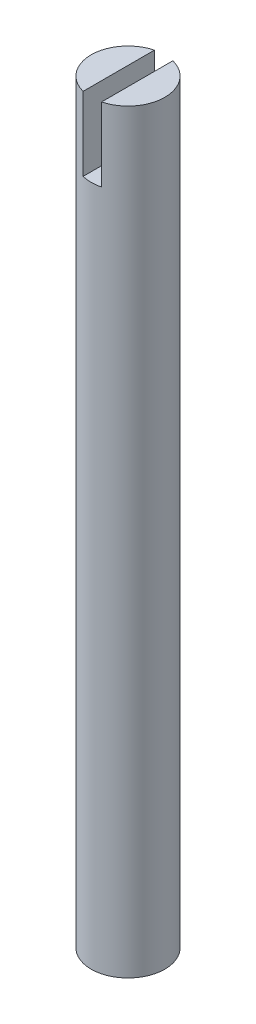
ISO-10303-21;
HEADER;
FILE_DESCRIPTION(('STEP AP214'),'2;1');
FILE_NAME('part.step','',(''),(''),'','','');
FILE_SCHEMA(('AUTOMOTIVE_DESIGN { 1 0 10303 214 1 1 1 1 }'));
ENDSEC;
DATA;
#1=APPLICATION_CONTEXT('core data for automotive mechanical design processes');
#2=APPLICATION_PROTOCOL_DEFINITION('international standard','automotive_design',2000,#1);
#3=PRODUCT_CONTEXT('',#1,'mechanical');
#4=PRODUCT('Part','Part','',(#3));
#5=PRODUCT_RELATED_PRODUCT_CATEGORY('part','',(#4));
#6=PRODUCT_DEFINITION_FORMATION('','',#4);
#7=PRODUCT_DEFINITION_CONTEXT('part definition',#1,'design');
#8=PRODUCT_DEFINITION('design','',#6,#7);
#9=PRODUCT_DEFINITION_SHAPE('','',#8);
#10=(LENGTH_UNIT() NAMED_UNIT(*) SI_UNIT(.MILLI.,.METRE.));
#11=(NAMED_UNIT(*) PLANE_ANGLE_UNIT() SI_UNIT($,.RADIAN.));
#12=(NAMED_UNIT(*) SI_UNIT($,.STERADIAN.) SOLID_ANGLE_UNIT());
#13=UNCERTAINTY_MEASURE_WITH_UNIT(LENGTH_MEASURE(1.E-05),#10,'distance_accuracy_value','');
#14=(GEOMETRIC_REPRESENTATION_CONTEXT(3) GLOBAL_UNCERTAINTY_ASSIGNED_CONTEXT((#13)) GLOBAL_UNIT_ASSIGNED_CONTEXT((#10,
#11,#12)) REPRESENTATION_CONTEXT('',''));
#15=CARTESIAN_POINT('',(0.,0.,0.));
#16=DIRECTION('',(0.,0.,1.));
#17=DIRECTION('',(1.,0.,0.));
#18=AXIS2_PLACEMENT_3D('',#15,#16,#17);
#19=CARTESIAN_POINT('',(0.,205.,0.));
#20=DIRECTION('',(0.,1.,0.));
#21=DIRECTION('',(0.,0.,1.));
#22=AXIS2_PLACEMENT_3D('',#19,#20,#21);
#23=PLANE('',#22);
#24=DIRECTION('',(0.,0.,-1.));
#25=VECTOR('',#24,1.);
#26=CARTESIAN_POINT('',(2.5,205.,0.));
#27=LINE('',#26,#25);
#28=CARTESIAN_POINT('',(2.5,205.,9.68245836551854));
#29=VERTEX_POINT('',#28);
#30=CARTESIAN_POINT('',(2.5,205.,-9.68245836551854));
#31=VERTEX_POINT('',#30);
#32=EDGE_CURVE('E81',#29,#31,#27,.T.);
#33=ORIENTED_EDGE('',*,*,#32,.F.);
#34=CARTESIAN_POINT('',(0.,205.,0.));
#35=DIRECTION('',(0.,1.,0.));
#36=DIRECTION('',(0.,0.,1.));
#37=AXIS2_PLACEMENT_3D('',#34,#35,#36);
#38=CIRCLE('',#37,10.);
#39=EDGE_CURVE('E82',#29,#31,#38,.T.);
#40=ORIENTED_EDGE('',*,*,#39,.T.);
#41=EDGE_LOOP('',(#33,#40));
#42=FACE_BOUND('',#41,.T.);
#43=ADVANCED_FACE('F34',(#42),#23,.T.);
#44=CARTESIAN_POINT('',(0.,205.,0.));
#45=DIRECTION('',(0.,-1.,0.));
#46=DIRECTION('',(0.,0.,-1.));
#47=AXIS2_PLACEMENT_3D('',#44,#45,#46);
#48=CYLINDRICAL_SURFACE('',#47,10.);
#49=CARTESIAN_POINT('',(0.,185.,0.));
#50=DIRECTION('',(0.,1.,0.));
#51=DIRECTION('',(0.,0.,1.));
#52=AXIS2_PLACEMENT_3D('',#49,#50,#51);
#53=CIRCLE('',#52,10.);
#54=CARTESIAN_POINT('',(2.5,185.,-9.68245836551854));
#55=VERTEX_POINT('',#54);
#56=CARTESIAN_POINT('',(-2.5,185.,-9.68245836551854));
#57=VERTEX_POINT('',#56);
#58=EDGE_CURVE('E11',#55,#57,#53,.T.);
#59=ORIENTED_EDGE('',*,*,#58,.F.);
#60=DIRECTION('',(0.,-1.,0.));
#61=VECTOR('',#60,1.);
#62=CARTESIAN_POINT('',(2.5,205.,-9.68245836551854));
#63=LINE('',#62,#61);
#64=EDGE_CURVE('E57',#55,#31,#63,.F.);
#65=ORIENTED_EDGE('',*,*,#64,.T.);
#66=ORIENTED_EDGE('',*,*,#39,.F.);
#67=DIRECTION('',(0.,-1.,0.));
#68=VECTOR('',#67,1.);
#69=CARTESIAN_POINT('',(2.5,205.,9.68245836551854));
#70=LINE('',#69,#68);
#71=CARTESIAN_POINT('',(2.5,185.,9.68245836551854));
#72=VERTEX_POINT('',#71);
#73=EDGE_CURVE('E97',#29,#72,#70,.T.);
#74=ORIENTED_EDGE('',*,*,#73,.T.);
#75=CARTESIAN_POINT('',(-2.5,185.,9.68245836551854));
#76=VERTEX_POINT('',#75);
#77=EDGE_CURVE('E38',#76,#72,#53,.T.);
#78=ORIENTED_EDGE('',*,*,#77,.F.);
#79=DIRECTION('',(0.,-1.,0.));
#80=VECTOR('',#79,1.);
#81=CARTESIAN_POINT('',(-2.5,205.,9.68245836551854));
#82=LINE('',#81,#80);
#83=CARTESIAN_POINT('',(-2.5,205.,9.68245836551854));
#84=VERTEX_POINT('',#83);
#85=EDGE_CURVE('E76',#76,#84,#82,.F.);
#86=ORIENTED_EDGE('',*,*,#85,.T.);
#87=CARTESIAN_POINT('',(-2.5,205.,-9.68245836551854));
#88=VERTEX_POINT('',#87);
#89=EDGE_CURVE('E88',#88,#84,#38,.T.);
#90=ORIENTED_EDGE('',*,*,#89,.F.);
#91=DIRECTION('',(0.,-1.,0.));
#92=VECTOR('',#91,1.);
#93=CARTESIAN_POINT('',(-2.5,205.,-9.68245836551854));
#94=LINE('',#93,#92);
#95=EDGE_CURVE('E49',#88,#57,#94,.T.);
#96=ORIENTED_EDGE('',*,*,#95,.T.);
#97=EDGE_LOOP('',(#59,#65,#66,#74,#78,#86,#90,#96));
#98=FACE_BOUND('',#97,.T.);
#99=CARTESIAN_POINT('',(0.,0.,0.));
#100=DIRECTION('',(0.,1.,0.));
#101=DIRECTION('',(0.,0.,1.));
#102=AXIS2_PLACEMENT_3D('',#99,#100,#101);
#103=CIRCLE('',#102,10.);
#104=CARTESIAN_POINT('',(0.,0.,10.));
#105=VERTEX_POINT('',#104);
#106=EDGE_CURVE('E93',#105,#105,#103,.T.);
#107=ORIENTED_EDGE('',*,*,#106,.T.);
#108=EDGE_LOOP('',(#107));
#109=FACE_BOUND('',#108,.T.);
#110=ADVANCED_FACE('F36',(#98,#109),#48,.T.);
#111=DIRECTION('',(0.,0.,1.));
#112=VECTOR('',#111,1.);
#113=CARTESIAN_POINT('',(-2.5,205.,0.));
#114=LINE('',#113,#112);
#115=EDGE_CURVE('E73',#88,#84,#114,.T.);
#116=ORIENTED_EDGE('',*,*,#115,.F.);
#117=ORIENTED_EDGE('',*,*,#89,.T.);
#118=EDGE_LOOP('',(#116,#117));
#119=FACE_BOUND('',#118,.T.);
#120=ADVANCED_FACE('F92',(#119),#23,.T.);
#121=CARTESIAN_POINT('',(0.,0.,0.));
#122=DIRECTION('',(0.,1.,0.));
#123=DIRECTION('',(0.,0.,1.));
#124=AXIS2_PLACEMENT_3D('',#121,#122,#123);
#125=PLANE('',#124);
#126=ORIENTED_EDGE('',*,*,#106,.F.);
#127=EDGE_LOOP('',(#126));
#128=FACE_BOUND('',#127,.T.);
#129=ADVANCED_FACE('F118',(#128),#125,.F.);
#130=CARTESIAN_POINT('',(0.,185.,0.));
#131=DIRECTION('',(0.,1.,0.));
#132=DIRECTION('',(0.,0.,1.));
#133=AXIS2_PLACEMENT_3D('',#130,#131,#132);
#134=PLANE('',#133);
#135=ORIENTED_EDGE('',*,*,#58,.T.);
#136=DIRECTION('',(0.,0.,1.));
#137=VECTOR('',#136,1.);
#138=CARTESIAN_POINT('',(-2.5,185.,-11.535));
#139=LINE('',#138,#137);
#140=EDGE_CURVE('E90',#57,#76,#139,.T.);
#141=ORIENTED_EDGE('',*,*,#140,.T.);
#142=ORIENTED_EDGE('',*,*,#77,.T.);
#143=DIRECTION('',(0.,0.,-1.));
#144=VECTOR('',#143,1.);
#145=CARTESIAN_POINT('',(2.5,185.,-11.535));
#146=LINE('',#145,#144);
#147=EDGE_CURVE('E104',#72,#55,#146,.T.);
#148=ORIENTED_EDGE('',*,*,#147,.T.);
#149=EDGE_LOOP('',(#135,#141,#142,#148));
#150=FACE_BOUND('',#149,.T.);
#151=ADVANCED_FACE('F103',(#150),#134,.T.);
#152=CARTESIAN_POINT('',(2.5,185.,-11.535));
#153=DIRECTION('',(1.,0.,0.));
#154=DIRECTION('',(0.,0.,-1.));
#155=AXIS2_PLACEMENT_3D('',#152,#153,#154);
#156=PLANE('',#155);
#157=ORIENTED_EDGE('',*,*,#32,.T.);
#158=ORIENTED_EDGE('',*,*,#64,.F.);
#159=ORIENTED_EDGE('',*,*,#147,.F.);
#160=ORIENTED_EDGE('',*,*,#73,.F.);
#161=EDGE_LOOP('',(#157,#158,#159,#160));
#162=FACE_BOUND('',#161,.T.);
#163=ADVANCED_FACE('F105',(#162),#156,.F.);
#164=CARTESIAN_POINT('',(-2.5,185.,-11.535));
#165=DIRECTION('',(-1.,0.,0.));
#166=DIRECTION('',(0.,0.,1.));
#167=AXIS2_PLACEMENT_3D('',#164,#165,#166);
#168=PLANE('',#167);
#169=ORIENTED_EDGE('',*,*,#115,.T.);
#170=ORIENTED_EDGE('',*,*,#85,.F.);
#171=ORIENTED_EDGE('',*,*,#140,.F.);
#172=ORIENTED_EDGE('',*,*,#95,.F.);
#173=EDGE_LOOP('',(#169,#170,#171,#172));
#174=FACE_BOUND('',#173,.T.);
#175=ADVANCED_FACE('F75',(#174),#168,.F.);
#176=CLOSED_SHELL('',(#43,#110,#120,#129,#151,#163,#175));
#177=MANIFOLD_SOLID_BREP('B2',#176);
#178=ADVANCED_BREP_SHAPE_REPRESENTATION('',(#18,#177),#14);
#179=SHAPE_DEFINITION_REPRESENTATION(#9,#178);
ENDSEC;
END-ISO-10303-21;
